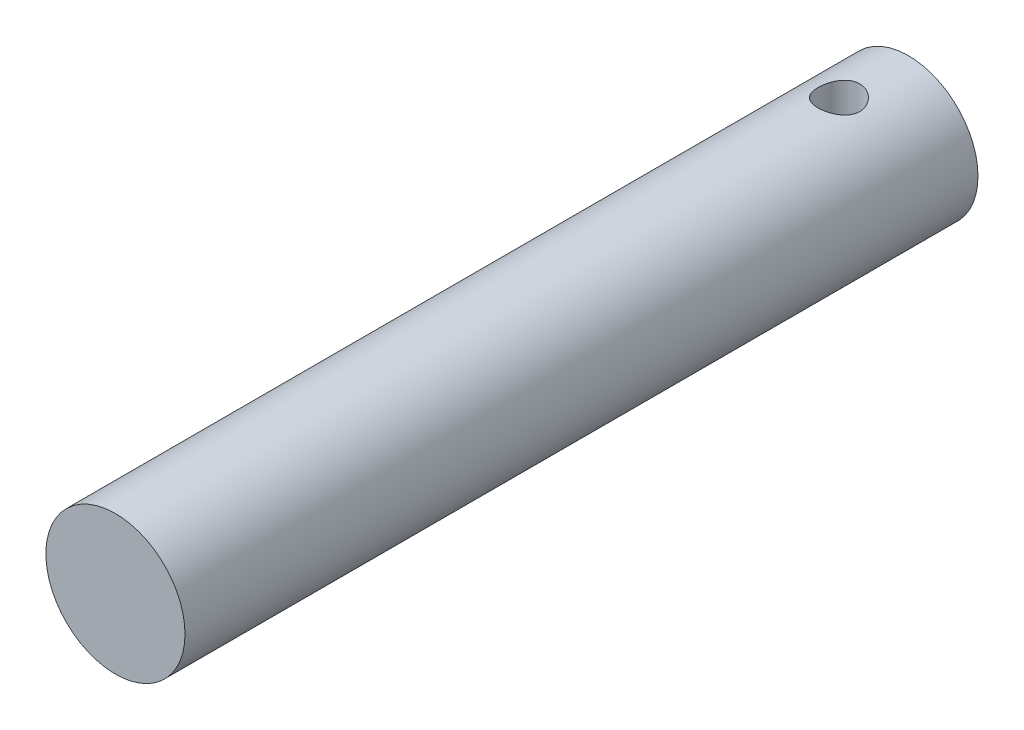
ISO-10303-21;
HEADER;
FILE_DESCRIPTION(('STEP AP214'),'2;1');
FILE_NAME('part.step','',(''),(''),'','','');
FILE_SCHEMA(('AUTOMOTIVE_DESIGN { 1 0 10303 214 1 1 1 1 }'));
ENDSEC;
DATA;
#1=APPLICATION_CONTEXT('core data for automotive mechanical design processes');
#2=APPLICATION_PROTOCOL_DEFINITION('international standard','automotive_design',2000,#1);
#3=PRODUCT_CONTEXT('',#1,'mechanical');
#4=PRODUCT('Part','Part','',(#3));
#5=PRODUCT_RELATED_PRODUCT_CATEGORY('part','',(#4));
#6=PRODUCT_DEFINITION_FORMATION('','',#4);
#7=PRODUCT_DEFINITION_CONTEXT('part definition',#1,'design');
#8=PRODUCT_DEFINITION('design','',#6,#7);
#9=PRODUCT_DEFINITION_SHAPE('','',#8);
#10=(LENGTH_UNIT() NAMED_UNIT(*) SI_UNIT(.MILLI.,.METRE.));
#11=(NAMED_UNIT(*) PLANE_ANGLE_UNIT() SI_UNIT($,.RADIAN.));
#12=(NAMED_UNIT(*) SI_UNIT($,.STERADIAN.) SOLID_ANGLE_UNIT());
#13=UNCERTAINTY_MEASURE_WITH_UNIT(LENGTH_MEASURE(1.E-05),#10,'distance_accuracy_value','');
#14=(GEOMETRIC_REPRESENTATION_CONTEXT(3) GLOBAL_UNCERTAINTY_ASSIGNED_CONTEXT((#13)) GLOBAL_UNIT_ASSIGNED_CONTEXT((#10,
#11,#12)) REPRESENTATION_CONTEXT('',''));
#15=CARTESIAN_POINT('',(0.,0.,0.));
#16=DIRECTION('',(0.,0.,1.));
#17=DIRECTION('',(1.,0.,0.));
#18=AXIS2_PLACEMENT_3D('',#15,#16,#17);
#19=CARTESIAN_POINT('',(0.,0.,28.5));
#20=DIRECTION('',(0.,0.,-1.));
#21=DIRECTION('',(-1.,0.,0.));
#22=AXIS2_PLACEMENT_3D('',#19,#20,#21);
#23=CYLINDRICAL_SURFACE('',#22,5.);
#24=CARTESIAN_POINT('',(0.,-5.,-22.));
#25=CARTESIAN_POINT('',(0.0822886127532999,-4.9999992925055,-22.0000009974849));
#26=CARTESIAN_POINT('',(0.164587318351529,-4.99794915693953,-22.006793863624));
#27=CARTESIAN_POINT('',(0.326788125304881,-4.98997105593691,-22.0337213542221));
#28=CARTESIAN_POINT('',(0.406689504411419,-4.98404193389692,-22.0538599580233));
#29=CARTESIAN_POINT('',(0.561732707754526,-4.96895552501836,-22.1067460169103));
#30=CARTESIAN_POINT('',(0.636881364395372,-4.95980300250425,-22.1394748696189));
#31=CARTESIAN_POINT('',(0.78062418105313,-4.93922109237645,-22.2165360930558));
#32=CARTESIAN_POINT('',(0.849217467469668,-4.92779140192067,-22.2608700073954));
#33=CARTESIAN_POINT('',(0.979871797183743,-4.90350737192774,-22.3612240074727));
#34=CARTESIAN_POINT('',(1.04171807124434,-4.89062383657036,-22.4175166258859));
#35=CARTESIAN_POINT('',(1.15524920923324,-4.86505834210442,-22.5396092299102));
#36=CARTESIAN_POINT('',(1.20693236327441,-4.85237641724501,-22.605410812125));
#37=CARTESIAN_POINT('',(1.29980037723708,-4.82834113993772,-22.7464707530376));
#38=CARTESIAN_POINT('',(1.34072309022213,-4.81702406663875,-22.8219084609907));
#39=CARTESIAN_POINT('',(1.4092139477476,-4.79743620394031,-22.9789892542303));
#40=CARTESIAN_POINT('',(1.43678529919973,-4.78916468313311,-23.060630843928));
#41=CARTESIAN_POINT('',(1.47701633682652,-4.77690870838434,-23.2253902661305));
#42=CARTESIAN_POINT('',(1.49007196234677,-4.77281069324533,-23.3084027438639));
#43=CARTESIAN_POINT('',(1.50213730614672,-4.76902789749767,-23.4755331562168));
#44=CARTESIAN_POINT('',(1.50115042761078,-4.76934204760571,-23.5596508180591));
#45=CARTESIAN_POINT('',(1.48546977199812,-4.77424744067778,-23.7233839086085));
#46=CARTESIAN_POINT('',(1.47127205262685,-4.7786838859914,-23.8030522503622));
#47=CARTESIAN_POINT('',(1.43037420427056,-4.79108356228624,-23.9588197862735));
#48=CARTESIAN_POINT('',(1.40367284141641,-4.7990471413235,-24.0349186273743));
#49=CARTESIAN_POINT('',(1.33816026653682,-4.81772733074973,-24.1826003496607));
#50=CARTESIAN_POINT('',(1.29918816934642,-4.82848016115952,-24.2541070839553));
#51=CARTESIAN_POINT('',(1.21035222588683,-4.85150987000064,-24.3897320220102));
#52=CARTESIAN_POINT('',(1.16048574002588,-4.86378711746991,-24.4538484294138));
#53=CARTESIAN_POINT('',(1.04881290765546,-4.88911011297937,-24.575686190762));
#54=CARTESIAN_POINT('',(0.986594907466974,-4.90216654310498,-24.6330286640297));
#55=CARTESIAN_POINT('',(0.853263259313969,-4.92712244063258,-24.7365539840643));
#56=CARTESIAN_POINT('',(0.78214905186089,-4.9390218351841,-24.7827361284144));
#57=CARTESIAN_POINT('',(0.632355038342805,-4.9604316006947,-24.8628599224647));
#58=CARTESIAN_POINT('',(0.553627749747952,-4.96992543668314,-24.8967175162499));
#59=CARTESIAN_POINT('',(0.39124541560352,-4.98533521832222,-24.9505995900996));
#60=CARTESIAN_POINT('',(0.307591751589583,-4.99125216186999,-24.9706279285325));
#61=CARTESIAN_POINT('',(0.140952242668333,-4.99868364643538,-24.9956521778994));
#62=CARTESIAN_POINT('',(0.0580500976011879,-5.0003485041779,-25.0011615858016));
#63=CARTESIAN_POINT('',(-0.107499605823382,-4.99952923241759,-24.9984308442879));
#64=CARTESIAN_POINT('',(-0.19014719669078,-4.99704565677756,-24.9901925303486));
#65=CARTESIAN_POINT('',(-0.350903605309696,-4.98830696987163,-24.9606153888885));
#66=CARTESIAN_POINT('',(-0.429072772614169,-4.98213829799417,-24.9395766124191));
#67=CARTESIAN_POINT('',(-0.580754638954522,-4.96674347841532,-24.8853567672218));
#68=CARTESIAN_POINT('',(-0.654266777025584,-4.95751696321085,-24.8521742389621));
#69=CARTESIAN_POINT('',(-0.796437189461053,-4.93669654351325,-24.7737468345189));
#70=CARTESIAN_POINT('',(-0.86494382619967,-4.92505280829675,-24.728240659052));
#71=CARTESIAN_POINT('',(-0.993523307980147,-4.90073468764317,-24.6267752459472));
#72=CARTESIAN_POINT('',(-1.05359403235594,-4.8880600443108,-24.5708133881123));
#73=CARTESIAN_POINT('',(-1.16585744551027,-4.86253171869138,-24.4476126916307));
#74=CARTESIAN_POINT('',(-1.21768481231504,-4.84968825033268,-24.3800381242283));
#75=CARTESIAN_POINT('',(-1.30928995072154,-4.82576515238463,-24.2368720609865));
#76=CARTESIAN_POINT('',(-1.34906803829472,-4.81468547654651,-24.1612807754418));
#77=CARTESIAN_POINT('',(-1.41517347127168,-4.79567189615055,-24.0044675087453));
#78=CARTESIAN_POINT('',(-1.4415634693705,-4.78772337843827,-23.9232738134634));
#79=CARTESIAN_POINT('',(-1.48021730815114,-4.77591594362794,-23.7573120310685));
#80=CARTESIAN_POINT('',(-1.49248598978779,-4.772055625083,-23.6725451792123));
#81=CARTESIAN_POINT('',(-1.50221984485059,-4.76899972496087,-23.5056384816238));
#82=CARTESIAN_POINT('',(-1.5002805530849,-4.76961647442754,-23.4235363489824));
#83=CARTESIAN_POINT('',(-1.48307505444814,-4.77499401288294,-23.2608858966272));
#84=CARTESIAN_POINT('',(-1.46780938124716,-4.77975463592551,-23.1803375148237));
#85=CARTESIAN_POINT('',(-1.42476888804136,-4.79275763670385,-23.0240546008572));
#86=CARTESIAN_POINT('',(-1.39715175507069,-4.80095604545964,-22.9482727126383));
#87=CARTESIAN_POINT('',(-1.33031507121129,-4.81990278909136,-22.8023575611823));
#88=CARTESIAN_POINT('',(-1.29109329962876,-4.83065161194312,-22.7322253823592));
#89=CARTESIAN_POINT('',(-1.20048763805072,-4.85397676425833,-22.5968368834729));
#90=CARTESIAN_POINT('',(-1.14871276092994,-4.86660540163797,-22.5318512387396));
#91=CARTESIAN_POINT('',(-1.03517434629782,-4.89201320450026,-22.4112975016921));
#92=CARTESIAN_POINT('',(-0.973408217134499,-4.90479240823905,-22.3557318605322));
#93=CARTESIAN_POINT('',(-0.839465762183247,-4.92950936570649,-22.253976587705));
#94=CARTESIAN_POINT('',(-0.767037885790607,-4.94141159765674,-22.2081085531445));
#95=CARTESIAN_POINT('',(-0.61514137398353,-4.96260680455813,-22.129264830096));
#96=CARTESIAN_POINT('',(-0.535676052998956,-4.97190099931066,-22.0962831117255));
#97=CARTESIAN_POINT('',(-0.380757712655282,-4.98602174969301,-22.0471047243473));
#98=CARTESIAN_POINT('',(-0.305786961954235,-4.99122027381067,-22.0294883271168));
#99=CARTESIAN_POINT('',(-0.15388019523078,-4.99820944494492,-22.0059364747584));
#100=CARTESIAN_POINT('',(-0.0769445098581397,-5.0000006615474,-21.9999990672952));
#101=CARTESIAN_POINT('',(0.,-5.,-22.));
#102=B_SPLINE_CURVE_WITH_KNOTS('',3,(#24,#25,#26,#27,#28,#29,#30,#31,#32,#33,#34,#35,#36,#37,
#38,#39,#40,#41,#42,#43,#44,#45,#46,#47,#48,#49,#50,#51,#52,#53,#54,#55,#56,#57,#58,#59,#60,#61,
#62,#63,#64,#65,#66,#67,#68,#69,#70,#71,#72,#73,#74,#75,#76,#77,#78,#79,#80,#81,#82,#83,#84,#85,
#86,#87,#88,#89,#90,#91,#92,#93,#94,#95,#96,#97,#98,#99,#100,#101),.UNSPECIFIED.,.T.,.F.,(4,2,2,
2,2,2,2,2,2,2,2,2,2,2,2,2,2,2,2,2,2,2,2,2,2,2,2,2,2,2,2,2,2,2,2,2,2,2,4),(0.,0.246583203612611,
0.493239964845999,0.739533676300873,0.985860164412701,1.23855602948191,1.49129437288633,
1.74971481004109,2.00807314543224,2.25919689356599,2.5102597831909,2.75226016697676,
2.99428443658001,3.2396242644712,3.48502360158555,3.74067104048167,3.99633456531071,
4.25371046881689,4.51101453528808,4.75908809438545,5.00712853550327,5.24956746682327,
5.49203554593729,5.74011305702908,5.98825282000191,6.24540400322819,6.50254844252681,
6.75847814951252,7.01432009460283,7.25950155466943,7.504673196616,7.74680040402721,
7.98897397553108,8.23996925679931,8.49102974897503,8.74942996156671,9.00770911595235,
9.2383169193046,9.46888616948875),.UNSPECIFIED.);
#103=CARTESIAN_POINT('',(0.,-5.,-22.));
#104=VERTEX_POINT('',#103);
#105=EDGE_CURVE('E10',#104,#104,#102,.T.);
#106=ORIENTED_EDGE('',*,*,#105,.T.);
#107=EDGE_LOOP('',(#106));
#108=FACE_BOUND('',#107,.T.);
#109=CARTESIAN_POINT('',(0.,5.,-22.));
#110=CARTESIAN_POINT('',(-0.0822886127532999,4.9999992925055,-22.0000009974849));
#111=CARTESIAN_POINT('',(-0.164587318351529,4.99794915693953,-22.006793863624));
#112=CARTESIAN_POINT('',(-0.326788125304881,4.98997105593691,-22.0337213542221));
#113=CARTESIAN_POINT('',(-0.406689504411419,4.98404193389692,-22.0538599580233));
#114=CARTESIAN_POINT('',(-0.561732707754526,4.96895552501836,-22.1067460169103));
#115=CARTESIAN_POINT('',(-0.636881364395372,4.95980300250425,-22.1394748696189));
#116=CARTESIAN_POINT('',(-0.78062418105313,4.93922109237645,-22.2165360930558));
#117=CARTESIAN_POINT('',(-0.849217467469668,4.92779140192067,-22.2608700073954));
#118=CARTESIAN_POINT('',(-0.979871797183743,4.90350737192774,-22.3612240074727));
#119=CARTESIAN_POINT('',(-1.04171807124434,4.89062383657036,-22.4175166258859));
#120=CARTESIAN_POINT('',(-1.15524920923324,4.86505834210442,-22.5396092299102));
#121=CARTESIAN_POINT('',(-1.20693236327441,4.85237641724501,-22.605410812125));
#122=CARTESIAN_POINT('',(-1.29980037723708,4.82834113993772,-22.7464707530376));
#123=CARTESIAN_POINT('',(-1.34072309022213,4.81702406663875,-22.8219084609907));
#124=CARTESIAN_POINT('',(-1.4092139477476,4.79743620394031,-22.9789892542303));
#125=CARTESIAN_POINT('',(-1.43678529919973,4.78916468313311,-23.060630843928));
#126=CARTESIAN_POINT('',(-1.47701633682652,4.77690870838434,-23.2253902661305));
#127=CARTESIAN_POINT('',(-1.49007196234677,4.77281069324533,-23.3084027438639));
#128=CARTESIAN_POINT('',(-1.50213730614672,4.76902789749767,-23.4755331562168));
#129=CARTESIAN_POINT('',(-1.50115042761078,4.76934204760571,-23.5596508180591));
#130=CARTESIAN_POINT('',(-1.48546977199812,4.77424744067778,-23.7233839086085));
#131=CARTESIAN_POINT('',(-1.47127205262685,4.7786838859914,-23.8030522503622));
#132=CARTESIAN_POINT('',(-1.43037420427056,4.79108356228624,-23.9588197862735));
#133=CARTESIAN_POINT('',(-1.40367284141641,4.7990471413235,-24.0349186273743));
#134=CARTESIAN_POINT('',(-1.33816026653682,4.81772733074973,-24.1826003496607));
#135=CARTESIAN_POINT('',(-1.29918816934642,4.82848016115952,-24.2541070839553));
#136=CARTESIAN_POINT('',(-1.21035222588683,4.85150987000064,-24.3897320220102));
#137=CARTESIAN_POINT('',(-1.16048574002588,4.86378711746991,-24.4538484294138));
#138=CARTESIAN_POINT('',(-1.04881290765546,4.88911011297937,-24.575686190762));
#139=CARTESIAN_POINT('',(-0.986594907466974,4.90216654310498,-24.6330286640297));
#140=CARTESIAN_POINT('',(-0.853263259313969,4.92712244063258,-24.7365539840643));
#141=CARTESIAN_POINT('',(-0.78214905186089,4.9390218351841,-24.7827361284144));
#142=CARTESIAN_POINT('',(-0.632355038342805,4.9604316006947,-24.8628599224647));
#143=CARTESIAN_POINT('',(-0.553627749747952,4.96992543668314,-24.8967175162499));
#144=CARTESIAN_POINT('',(-0.39124541560352,4.98533521832222,-24.9505995900996));
#145=CARTESIAN_POINT('',(-0.307591751589583,4.99125216186999,-24.9706279285325));
#146=CARTESIAN_POINT('',(-0.140952242668333,4.99868364643538,-24.9956521778994));
#147=CARTESIAN_POINT('',(-0.0580500976011879,5.0003485041779,-25.0011615858016));
#148=CARTESIAN_POINT('',(0.107499605823382,4.99952923241759,-24.9984308442879));
#149=CARTESIAN_POINT('',(0.19014719669078,4.99704565677756,-24.9901925303486));
#150=CARTESIAN_POINT('',(0.350903605309696,4.98830696987163,-24.9606153888885));
#151=CARTESIAN_POINT('',(0.429072772614169,4.98213829799417,-24.9395766124191));
#152=CARTESIAN_POINT('',(0.580754638954522,4.96674347841532,-24.8853567672218));
#153=CARTESIAN_POINT('',(0.654266777025584,4.95751696321085,-24.8521742389621));
#154=CARTESIAN_POINT('',(0.796437189461053,4.93669654351325,-24.7737468345189));
#155=CARTESIAN_POINT('',(0.86494382619967,4.92505280829675,-24.728240659052));
#156=CARTESIAN_POINT('',(0.993523307980147,4.90073468764317,-24.6267752459472));
#157=CARTESIAN_POINT('',(1.05359403235594,4.8880600443108,-24.5708133881123));
#158=CARTESIAN_POINT('',(1.16585744551027,4.86253171869138,-24.4476126916307));
#159=CARTESIAN_POINT('',(1.21768481231504,4.84968825033268,-24.3800381242283));
#160=CARTESIAN_POINT('',(1.30928995072154,4.82576515238463,-24.2368720609865));
#161=CARTESIAN_POINT('',(1.34906803829472,4.81468547654651,-24.1612807754418));
#162=CARTESIAN_POINT('',(1.41517347127168,4.79567189615055,-24.0044675087453));
#163=CARTESIAN_POINT('',(1.4415634693705,4.78772337843827,-23.9232738134634));
#164=CARTESIAN_POINT('',(1.48021730815114,4.77591594362794,-23.7573120310685));
#165=CARTESIAN_POINT('',(1.49248598978779,4.772055625083,-23.6725451792123));
#166=CARTESIAN_POINT('',(1.50221984485059,4.76899972496087,-23.5056384816238));
#167=CARTESIAN_POINT('',(1.5002805530849,4.76961647442754,-23.4235363489824));
#168=CARTESIAN_POINT('',(1.48307505444814,4.77499401288294,-23.2608858966272));
#169=CARTESIAN_POINT('',(1.46780938124716,4.77975463592551,-23.1803375148237));
#170=CARTESIAN_POINT('',(1.42476888804136,4.79275763670385,-23.0240546008572));
#171=CARTESIAN_POINT('',(1.39715175507069,4.80095604545964,-22.9482727126383));
#172=CARTESIAN_POINT('',(1.33031507121129,4.81990278909136,-22.8023575611823));
#173=CARTESIAN_POINT('',(1.29109329962876,4.83065161194312,-22.7322253823592));
#174=CARTESIAN_POINT('',(1.20048763805072,4.85397676425833,-22.5968368834729));
#175=CARTESIAN_POINT('',(1.14871276092994,4.86660540163797,-22.5318512387396));
#176=CARTESIAN_POINT('',(1.03517434629782,4.89201320450026,-22.4112975016921));
#177=CARTESIAN_POINT('',(0.973408217134499,4.90479240823905,-22.3557318605322));
#178=CARTESIAN_POINT('',(0.839465762183247,4.92950936570649,-22.253976587705));
#179=CARTESIAN_POINT('',(0.767037885790607,4.94141159765674,-22.2081085531445));
#180=CARTESIAN_POINT('',(0.61514137398353,4.96260680455813,-22.129264830096));
#181=CARTESIAN_POINT('',(0.535676052998956,4.97190099931066,-22.0962831117255));
#182=CARTESIAN_POINT('',(0.380757712655282,4.98602174969301,-22.0471047243473));
#183=CARTESIAN_POINT('',(0.305786961954235,4.99122027381067,-22.0294883271168));
#184=CARTESIAN_POINT('',(0.15388019523078,4.99820944494492,-22.0059364747584));
#185=CARTESIAN_POINT('',(0.0769445098581397,5.0000006615474,-21.9999990672952));
#186=CARTESIAN_POINT('',(0.,5.,-22.));
#187=B_SPLINE_CURVE_WITH_KNOTS('',3,(#109,#110,#111,#112,#113,#114,#115,#116,#117,#118,#119,
#120,#121,#122,#123,#124,#125,#126,#127,#128,#129,#130,#131,#132,#133,#134,#135,#136,#137,#138,
#139,#140,#141,#142,#143,#144,#145,#146,#147,#148,#149,#150,#151,#152,#153,#154,#155,#156,#157,
#158,#159,#160,#161,#162,#163,#164,#165,#166,#167,#168,#169,#170,#171,#172,#173,#174,#175,#176,
#177,#178,#179,#180,#181,#182,#183,#184,#185,#186),.UNSPECIFIED.,.T.,.F.,(4,2,2,2,2,2,2,2,2,2,2,
2,2,2,2,2,2,2,2,2,2,2,2,2,2,2,2,2,2,2,2,2,2,2,2,2,2,2,4),(0.,0.246583203612611,
0.493239964845999,0.739533676300873,0.985860164412701,1.23855602948191,1.49129437288633,
1.74971481004109,2.00807314543224,2.25919689356599,2.5102597831909,2.75226016697676,
2.99428443658001,3.2396242644712,3.48502360158555,3.74067104048167,3.99633456531071,
4.25371046881689,4.51101453528808,4.75908809438545,5.00712853550327,5.24956746682327,
5.49203554593729,5.74011305702908,5.98825282000191,6.24540400322819,6.50254844252681,
6.75847814951252,7.01432009460283,7.25950155466943,7.504673196616,7.74680040402721,
7.98897397553108,8.23996925679931,8.49102974897503,8.74942996156671,9.00770911595235,
9.2383169193046,9.46888616948875),.UNSPECIFIED.);
#188=CARTESIAN_POINT('',(0.,5.,-22.));
#189=VERTEX_POINT('',#188);
#190=EDGE_CURVE('E47',#189,#189,#187,.T.);
#191=ORIENTED_EDGE('',*,*,#190,.T.);
#192=EDGE_LOOP('',(#191));
#193=FACE_BOUND('',#192,.T.);
#194=CARTESIAN_POINT('',(0.,0.,28.5));
#195=DIRECTION('',(0.,0.,1.));
#196=DIRECTION('',(1.,0.,0.));
#197=AXIS2_PLACEMENT_3D('',#194,#195,#196);
#198=CIRCLE('',#197,5.);
#199=CARTESIAN_POINT('',(5.,0.,28.5));
#200=VERTEX_POINT('',#199);
#201=EDGE_CURVE('E51',#200,#200,#198,.T.);
#202=ORIENTED_EDGE('',*,*,#201,.F.);
#203=EDGE_LOOP('',(#202));
#204=FACE_BOUND('',#203,.T.);
#205=CARTESIAN_POINT('',(0.,0.,-28.5));
#206=DIRECTION('',(0.,0.,1.));
#207=DIRECTION('',(1.,0.,0.));
#208=AXIS2_PLACEMENT_3D('',#205,#206,#207);
#209=CIRCLE('',#208,5.);
#210=CARTESIAN_POINT('',(5.,0.,-28.5));
#211=VERTEX_POINT('',#210);
#212=EDGE_CURVE('E55',#211,#211,#209,.T.);
#213=ORIENTED_EDGE('',*,*,#212,.T.);
#214=EDGE_LOOP('',(#213));
#215=FACE_BOUND('',#214,.T.);
#216=ADVANCED_FACE('F36',(#108,#193,#204,#215),#23,.T.);
#217=CARTESIAN_POINT('',(0.,0.,28.5));
#218=DIRECTION('',(0.,0.,1.));
#219=DIRECTION('',(1.,0.,0.));
#220=AXIS2_PLACEMENT_3D('',#217,#218,#219);
#221=PLANE('',#220);
#222=ORIENTED_EDGE('',*,*,#201,.T.);
#223=EDGE_LOOP('',(#222));
#224=FACE_BOUND('',#223,.T.);
#225=ADVANCED_FACE('F67',(#224),#221,.T.);
#226=CARTESIAN_POINT('',(0.,0.,-28.5));
#227=DIRECTION('',(0.,0.,1.));
#228=DIRECTION('',(1.,0.,0.));
#229=AXIS2_PLACEMENT_3D('',#226,#227,#228);
#230=PLANE('',#229);
#231=ORIENTED_EDGE('',*,*,#212,.F.);
#232=EDGE_LOOP('',(#231));
#233=FACE_BOUND('',#232,.T.);
#234=ADVANCED_FACE('F65',(#233),#230,.F.);
#235=CARTESIAN_POINT('',(0.,-5.,-23.5));
#236=DIRECTION('',(0.,1.,0.));
#237=DIRECTION('',(0.,0.,1.));
#238=AXIS2_PLACEMENT_3D('',#235,#236,#237);
#239=CYLINDRICAL_SURFACE('',#238,1.5);
#240=ORIENTED_EDGE('',*,*,#190,.F.);
#241=EDGE_LOOP('',(#240));
#242=FACE_BOUND('',#241,.T.);
#243=ORIENTED_EDGE('',*,*,#105,.F.);
#244=EDGE_LOOP('',(#243));
#245=FACE_BOUND('',#244,.T.);
#246=ADVANCED_FACE('F61',(#242,#245),#239,.F.);
#247=CLOSED_SHELL('',(#216,#225,#234,#246));
#248=MANIFOLD_SOLID_BREP('B2',#247);
#249=ADVANCED_BREP_SHAPE_REPRESENTATION('',(#18,#248),#14);
#250=SHAPE_DEFINITION_REPRESENTATION(#9,#249);
ENDSEC;
END-ISO-10303-21;
